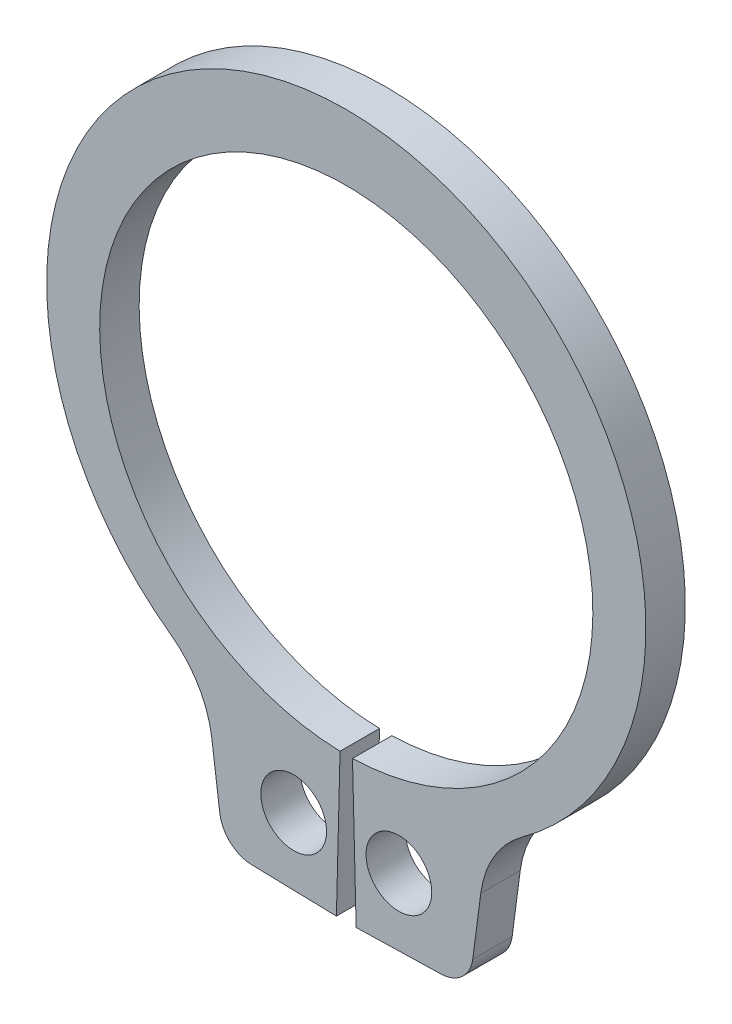
ISO-10303-21;
HEADER;
FILE_DESCRIPTION(('STEP AP214'),'2;1');
FILE_NAME('part.step','',(''),(''),'','','');
FILE_SCHEMA(('AUTOMOTIVE_DESIGN { 1 0 10303 214 1 1 1 1 }'));
ENDSEC;
DATA;
#1=APPLICATION_CONTEXT('core data for automotive mechanical design processes');
#2=APPLICATION_PROTOCOL_DEFINITION('international standard','automotive_design',2000,#1);
#3=PRODUCT_CONTEXT('',#1,'mechanical');
#4=PRODUCT('Part','Part','',(#3));
#5=PRODUCT_RELATED_PRODUCT_CATEGORY('part','',(#4));
#6=PRODUCT_DEFINITION_FORMATION('','',#4);
#7=PRODUCT_DEFINITION_CONTEXT('part definition',#1,'design');
#8=PRODUCT_DEFINITION('design','',#6,#7);
#9=PRODUCT_DEFINITION_SHAPE('','',#8);
#10=(LENGTH_UNIT() NAMED_UNIT(*) SI_UNIT(.MILLI.,.METRE.));
#11=(NAMED_UNIT(*) PLANE_ANGLE_UNIT() SI_UNIT($,.RADIAN.));
#12=(NAMED_UNIT(*) SI_UNIT($,.STERADIAN.) SOLID_ANGLE_UNIT());
#13=UNCERTAINTY_MEASURE_WITH_UNIT(LENGTH_MEASURE(1.E-05),#10,'distance_accuracy_value','');
#14=(GEOMETRIC_REPRESENTATION_CONTEXT(3) GLOBAL_UNCERTAINTY_ASSIGNED_CONTEXT((#13)) GLOBAL_UNIT_ASSIGNED_CONTEXT((#10,
#11,#12)) REPRESENTATION_CONTEXT('',''));
#15=CARTESIAN_POINT('',(0.,0.,0.));
#16=DIRECTION('',(0.,0.,1.));
#17=DIRECTION('',(1.,0.,0.));
#18=AXIS2_PLACEMENT_3D('',#15,#16,#17);
#19=CARTESIAN_POINT('',(0.,0.,-0.6));
#20=DIRECTION('',(0.,0.,1.));
#21=DIRECTION('',(1.,0.,0.));
#22=AXIS2_PLACEMENT_3D('',#19,#20,#21);
#23=CYLINDRICAL_SURFACE('',#22,3.75);
#24=CARTESIAN_POINT('',(0.,0.,0.));
#25=DIRECTION('',(0.,0.,-1.));
#26=DIRECTION('',(1.,0.,0.));
#27=AXIS2_PLACEMENT_3D('',#24,#25,#26);
#28=CIRCLE('',#27,3.75);
#29=CARTESIAN_POINT('',(-0.0945378151260504,-3.74880815746968,0.));
#30=VERTEX_POINT('',#29);
#31=CARTESIAN_POINT('',(0.0945378151260504,-3.74880815746968,0.));
#32=VERTEX_POINT('',#31);
#33=EDGE_CURVE('E156',#30,#32,#28,.T.);
#34=ORIENTED_EDGE('',*,*,#33,.F.);
#35=DIRECTION('',(0.,0.,1.));
#36=VECTOR('',#35,1.);
#37=CARTESIAN_POINT('',(-0.0945378151260504,-3.74880815746968,-0.6));
#38=LINE('',#37,#36);
#39=CARTESIAN_POINT('',(-0.0945378151260504,-3.74880815746968,-0.6));
#40=VERTEX_POINT('',#39);
#41=EDGE_CURVE('E11',#40,#30,#38,.T.);
#42=ORIENTED_EDGE('',*,*,#41,.F.);
#43=CARTESIAN_POINT('',(0.,0.,-0.6));
#44=DIRECTION('',(0.,0.,-1.));
#45=DIRECTION('',(1.,0.,0.));
#46=AXIS2_PLACEMENT_3D('',#43,#44,#45);
#47=CIRCLE('',#46,3.75);
#48=CARTESIAN_POINT('',(0.0945378151260504,-3.74880815746968,-0.6));
#49=VERTEX_POINT('',#48);
#50=EDGE_CURVE('E189',#40,#49,#47,.T.);
#51=ORIENTED_EDGE('',*,*,#50,.T.);
#52=DIRECTION('',(0.,0.,1.));
#53=VECTOR('',#52,1.);
#54=CARTESIAN_POINT('',(0.0945378151260504,-3.74880815746968,-0.6));
#55=LINE('',#54,#53);
#56=EDGE_CURVE('E38',#49,#32,#55,.T.);
#57=ORIENTED_EDGE('',*,*,#56,.T.);
#58=EDGE_LOOP('',(#34,#42,#51,#57));
#59=FACE_BOUND('',#58,.T.);
#60=ADVANCED_FACE('F35',(#59),#23,.F.);
#61=CARTESIAN_POINT('',(-0.0945378151260504,-3.74880815746968,-0.6));
#62=DIRECTION('',(0.999682175325247,-0.0252100840336134,0.));
#63=DIRECTION('',(0.0252100840336134,0.999682175325247,0.));
#64=AXIS2_PLACEMENT_3D('',#61,#62,#63);
#65=PLANE('',#64);
#66=DIRECTION('',(0.0252100840336134,0.999682175325247,0.));
#67=VECTOR('',#66,1.);
#68=CARTESIAN_POINT('',(-0.0945378151260504,-3.74880815746968,0.));
#69=LINE('',#68,#67);
#70=CARTESIAN_POINT('',(-0.15,-5.94810894318522,0.));
#71=VERTEX_POINT('',#70);
#72=EDGE_CURVE('E187',#71,#30,#69,.T.);
#73=ORIENTED_EDGE('',*,*,#72,.F.);
#74=DIRECTION('',(0.,0.,1.));
#75=VECTOR('',#74,1.);
#76=CARTESIAN_POINT('',(-0.15,-5.94810894318522,-0.6));
#77=LINE('',#76,#75);
#78=CARTESIAN_POINT('',(-0.15,-5.94810894318522,-0.6));
#79=VERTEX_POINT('',#78);
#80=EDGE_CURVE('E44',#79,#71,#77,.T.);
#81=ORIENTED_EDGE('',*,*,#80,.F.);
#82=DIRECTION('',(0.0252100840336134,0.999682175325247,0.));
#83=VECTOR('',#82,1.);
#84=CARTESIAN_POINT('',(-0.0945378151260504,-3.74880815746968,-0.6));
#85=LINE('',#84,#83);
#86=EDGE_CURVE('E146',#79,#40,#85,.T.);
#87=ORIENTED_EDGE('',*,*,#86,.T.);
#88=ORIENTED_EDGE('',*,*,#41,.T.);
#89=EDGE_LOOP('',(#73,#81,#87,#88));
#90=FACE_BOUND('',#89,.T.);
#91=ADVANCED_FACE('F209',(#90),#65,.T.);
#92=CARTESIAN_POINT('',(-0.15,-5.94810894318522,-0.6));
#93=DIRECTION('',(-0.025210084033613,-0.999682175325247,0.));
#94=DIRECTION('',(0.999682175325247,-0.025210084033613,0.));
#95=AXIS2_PLACEMENT_3D('',#92,#93,#94);
#96=PLANE('',#95);
#97=DIRECTION('',(0.999682175325247,-0.025210084033613,0.));
#98=VECTOR('',#97,1.);
#99=CARTESIAN_POINT('',(-0.15,-5.94810894318522,0.));
#100=LINE('',#99,#98);
#101=CARTESIAN_POINT('',(-1.43976416414528,-5.91558354284879,0.));
#102=VERTEX_POINT('',#101);
#103=EDGE_CURVE('E133',#102,#71,#100,.T.);
#104=ORIENTED_EDGE('',*,*,#103,.F.);
#105=DIRECTION('',(0.,0.,1.));
#106=VECTOR('',#105,1.);
#107=CARTESIAN_POINT('',(-1.43976416414528,-5.91558354284879,-0.6));
#108=LINE('',#107,#106);
#109=CARTESIAN_POINT('',(-1.43976416414528,-5.91558354284879,-0.6));
#110=VERTEX_POINT('',#109);
#111=EDGE_CURVE('E128',#110,#102,#108,.T.);
#112=ORIENTED_EDGE('',*,*,#111,.F.);
#113=DIRECTION('',(0.999682175325247,-0.025210084033613,0.));
#114=VECTOR('',#113,1.);
#115=CARTESIAN_POINT('',(-0.15,-5.94810894318522,-0.6));
#116=LINE('',#115,#114);
#117=EDGE_CURVE('E131',#110,#79,#116,.T.);
#118=ORIENTED_EDGE('',*,*,#117,.T.);
#119=ORIENTED_EDGE('',*,*,#80,.T.);
#120=EDGE_LOOP('',(#104,#112,#118,#119));
#121=FACE_BOUND('',#120,.T.);
#122=ADVANCED_FACE('F130',(#121),#96,.T.);
#123=CARTESIAN_POINT('',(-1.42715912212848,-5.41574245518617,-0.6));
#124=DIRECTION('',(0.,0.,1.));
#125=DIRECTION('',(1.,0.,0.));
#126=AXIS2_PLACEMENT_3D('',#123,#124,#125);
#127=CYLINDRICAL_SURFACE('',#126,0.5);
#128=CARTESIAN_POINT('',(-1.42715912212848,-5.41574245518617,0.));
#129=DIRECTION('',(0.,0.,1.));
#130=DIRECTION('',(1.,0.,0.));
#131=AXIS2_PLACEMENT_3D('',#128,#129,#130);
#132=CIRCLE('',#131,0.5);
#133=CARTESIAN_POINT('',(-1.92288155281538,-5.4810055512962,0.));
#134=VERTEX_POINT('',#133);
#135=EDGE_CURVE('E184',#134,#102,#132,.T.);
#136=ORIENTED_EDGE('',*,*,#135,.F.);
#137=DIRECTION('',(0.,0.,1.));
#138=VECTOR('',#137,1.);
#139=CARTESIAN_POINT('',(-1.92288155281538,-5.4810055512962,-0.6));
#140=LINE('',#139,#138);
#141=CARTESIAN_POINT('',(-1.92288155281538,-5.4810055512962,-0.6));
#142=VERTEX_POINT('',#141);
#143=EDGE_CURVE('E138',#142,#134,#140,.T.);
#144=ORIENTED_EDGE('',*,*,#143,.F.);
#145=CARTESIAN_POINT('',(-1.42715912212848,-5.41574245518617,-0.6));
#146=DIRECTION('',(0.,0.,1.));
#147=DIRECTION('',(1.,0.,0.));
#148=AXIS2_PLACEMENT_3D('',#145,#146,#147);
#149=CIRCLE('',#148,0.5);
#150=EDGE_CURVE('E144',#142,#110,#149,.T.);
#151=ORIENTED_EDGE('',*,*,#150,.T.);
#152=ORIENTED_EDGE('',*,*,#111,.T.);
#153=EDGE_LOOP('',(#136,#144,#151,#152));
#154=FACE_BOUND('',#153,.T.);
#155=ADVANCED_FACE('F148',(#154),#127,.T.);
#156=CARTESIAN_POINT('',(-2.04561881867482,-4.54872345935972,-0.6));
#157=DIRECTION('',(-0.99144486137381,-0.130526192220054,0.));
#158=DIRECTION('',(0.130526192220054,-0.99144486137381,0.));
#159=AXIS2_PLACEMENT_3D('',#156,#157,#158);
#160=PLANE('',#159);
#161=DIRECTION('',(0.130526192220054,-0.99144486137381,0.));
#162=VECTOR('',#161,1.);
#163=CARTESIAN_POINT('',(-2.04561881867482,-4.54872345935972,0.));
#164=LINE('',#163,#162);
#165=CARTESIAN_POINT('',(-2.04561881867482,-4.54872345935972,0.));
#166=VERTEX_POINT('',#165);
#167=EDGE_CURVE('E181',#166,#134,#164,.T.);
#168=ORIENTED_EDGE('',*,*,#167,.F.);
#169=DIRECTION('',(0.,0.,1.));
#170=VECTOR('',#169,1.);
#171=CARTESIAN_POINT('',(-2.04561881867482,-4.54872345935972,-0.6));
#172=LINE('',#171,#170);
#173=CARTESIAN_POINT('',(-2.04561881867482,-4.54872345935972,-0.6));
#174=VERTEX_POINT('',#173);
#175=EDGE_CURVE('E193',#174,#166,#172,.T.);
#176=ORIENTED_EDGE('',*,*,#175,.F.);
#177=DIRECTION('',(0.130526192220054,-0.99144486137381,0.));
#178=VECTOR('',#177,1.);
#179=CARTESIAN_POINT('',(-2.04561881867482,-4.54872345935972,-0.6));
#180=LINE('',#179,#178);
#181=EDGE_CURVE('E149',#174,#142,#180,.T.);
#182=ORIENTED_EDGE('',*,*,#181,.T.);
#183=ORIENTED_EDGE('',*,*,#143,.T.);
#184=EDGE_LOOP('',(#168,#176,#182,#183));
#185=FACE_BOUND('',#184,.T.);
#186=ADVANCED_FACE('F222',(#185),#160,.T.);
#187=CARTESIAN_POINT('',(-3.58198243178211,-4.75098956622769,-0.6));
#188=DIRECTION('',(0.,0.,1.));
#189=DIRECTION('',(1.,0.,0.));
#190=AXIS2_PLACEMENT_3D('',#187,#188,#189);
#191=CYLINDRICAL_SURFACE('',#190,1.54962083416157);
#192=CARTESIAN_POINT('',(-3.58198243178211,-4.75098956622769,0.));
#193=DIRECTION('',(0.,0.,-1.));
#194=DIRECTION('',(1.,0.,0.));
#195=AXIS2_PLACEMENT_3D('',#192,#193,#194);
#196=CIRCLE('',#195,1.54962083416157);
#197=CARTESIAN_POINT('',(-2.67290002702444,-3.49604179399666,0.));
#198=VERTEX_POINT('',#197);
#199=EDGE_CURVE('E178',#198,#166,#196,.T.);
#200=ORIENTED_EDGE('',*,*,#199,.F.);
#201=DIRECTION('',(0.,0.,1.));
#202=VECTOR('',#201,1.);
#203=CARTESIAN_POINT('',(-2.67290002702444,-3.49604179399666,-0.6));
#204=LINE('',#203,#202);
#205=CARTESIAN_POINT('',(-2.67290002702444,-3.49604179399666,-0.6));
#206=VERTEX_POINT('',#205);
#207=EDGE_CURVE('E195',#206,#198,#204,.T.);
#208=ORIENTED_EDGE('',*,*,#207,.F.);
#209=CARTESIAN_POINT('',(-3.58198243178211,-4.75098956622769,-0.6));
#210=DIRECTION('',(0.,0.,-1.));
#211=DIRECTION('',(1.,0.,0.));
#212=AXIS2_PLACEMENT_3D('',#209,#210,#211);
#213=CIRCLE('',#212,1.54962083416157);
#214=EDGE_CURVE('E151',#206,#174,#213,.T.);
#215=ORIENTED_EDGE('',*,*,#214,.T.);
#216=ORIENTED_EDGE('',*,*,#175,.T.);
#217=EDGE_LOOP('',(#200,#208,#215,#216));
#218=FACE_BOUND('',#217,.T.);
#219=ADVANCED_FACE('F225',(#218),#191,.F.);
#220=CARTESIAN_POINT('',(0.,0.193777651144577,-0.6));
#221=DIRECTION('',(0.,0.,1.));
#222=DIRECTION('',(1.,0.,0.));
#223=AXIS2_PLACEMENT_3D('',#220,#221,#222);
#224=CYLINDRICAL_SURFACE('',#223,4.55622234885542);
#225=CARTESIAN_POINT('',(0.,0.193777651144577,0.));
#226=DIRECTION('',(0.,0.,1.));
#227=DIRECTION('',(1.,0.,0.));
#228=AXIS2_PLACEMENT_3D('',#225,#226,#227);
#229=CIRCLE('',#228,4.55622234885542);
#230=CARTESIAN_POINT('',(2.67290002702444,-3.49604179399666,0.));
#231=VERTEX_POINT('',#230);
#232=EDGE_CURVE('E175',#231,#198,#229,.T.);
#233=ORIENTED_EDGE('',*,*,#232,.F.);
#234=DIRECTION('',(0.,0.,1.));
#235=VECTOR('',#234,1.);
#236=CARTESIAN_POINT('',(2.67290002702444,-3.49604179399666,-0.6));
#237=LINE('',#236,#235);
#238=CARTESIAN_POINT('',(2.67290002702444,-3.49604179399666,-0.6));
#239=VERTEX_POINT('',#238);
#240=EDGE_CURVE('E197',#239,#231,#237,.T.);
#241=ORIENTED_EDGE('',*,*,#240,.F.);
#242=CARTESIAN_POINT('',(0.,0.193777651144577,-0.6));
#243=DIRECTION('',(0.,0.,1.));
#244=DIRECTION('',(1.,0.,0.));
#245=AXIS2_PLACEMENT_3D('',#242,#243,#244);
#246=CIRCLE('',#245,4.55622234885542);
#247=EDGE_CURVE('E299',#239,#206,#246,.T.);
#248=ORIENTED_EDGE('',*,*,#247,.T.);
#249=ORIENTED_EDGE('',*,*,#207,.T.);
#250=EDGE_LOOP('',(#233,#241,#248,#249));
#251=FACE_BOUND('',#250,.T.);
#252=ADVANCED_FACE('F229',(#251),#224,.T.);
#253=CARTESIAN_POINT('',(3.58198243178211,-4.75098956622769,-0.6));
#254=DIRECTION('',(0.,0.,1.));
#255=DIRECTION('',(1.,0.,0.));
#256=AXIS2_PLACEMENT_3D('',#253,#254,#255);
#257=CYLINDRICAL_SURFACE('',#256,1.54962083416157);
#258=CARTESIAN_POINT('',(3.58198243178211,-4.75098956622769,0.));
#259=DIRECTION('',(0.,0.,-1.));
#260=DIRECTION('',(1.,0.,0.));
#261=AXIS2_PLACEMENT_3D('',#258,#259,#260);
#262=CIRCLE('',#261,1.54962083416157);
#263=CARTESIAN_POINT('',(2.04561881867482,-4.54872345935972,0.));
#264=VERTEX_POINT('',#263);
#265=EDGE_CURVE('E172',#264,#231,#262,.T.);
#266=ORIENTED_EDGE('',*,*,#265,.F.);
#267=DIRECTION('',(0.,0.,1.));
#268=VECTOR('',#267,1.);
#269=CARTESIAN_POINT('',(2.04561881867482,-4.54872345935972,-0.6));
#270=LINE('',#269,#268);
#271=CARTESIAN_POINT('',(2.04561881867482,-4.54872345935972,-0.6));
#272=VERTEX_POINT('',#271);
#273=EDGE_CURVE('E199',#272,#264,#270,.T.);
#274=ORIENTED_EDGE('',*,*,#273,.F.);
#275=CARTESIAN_POINT('',(3.58198243178211,-4.75098956622769,-0.6));
#276=DIRECTION('',(0.,0.,-1.));
#277=DIRECTION('',(1.,0.,0.));
#278=AXIS2_PLACEMENT_3D('',#275,#276,#277);
#279=CIRCLE('',#278,1.54962083416157);
#280=EDGE_CURVE('E296',#272,#239,#279,.T.);
#281=ORIENTED_EDGE('',*,*,#280,.T.);
#282=ORIENTED_EDGE('',*,*,#240,.T.);
#283=EDGE_LOOP('',(#266,#274,#281,#282));
#284=FACE_BOUND('',#283,.T.);
#285=ADVANCED_FACE('F233',(#284),#257,.F.);
#286=CARTESIAN_POINT('',(2.04561881867482,-4.54872345935972,-0.6));
#287=DIRECTION('',(0.99144486137381,-0.130526192220054,0.));
#288=DIRECTION('',(0.130526192220054,0.99144486137381,0.));
#289=AXIS2_PLACEMENT_3D('',#286,#287,#288);
#290=PLANE('',#289);
#291=DIRECTION('',(0.130526192220054,0.99144486137381,0.));
#292=VECTOR('',#291,1.);
#293=CARTESIAN_POINT('',(2.04561881867482,-4.54872345935972,0.));
#294=LINE('',#293,#292);
#295=CARTESIAN_POINT('',(1.92288155281538,-5.4810055512962,0.));
#296=VERTEX_POINT('',#295);
#297=EDGE_CURVE('E169',#296,#264,#294,.T.);
#298=ORIENTED_EDGE('',*,*,#297,.F.);
#299=DIRECTION('',(0.,0.,1.));
#300=VECTOR('',#299,1.);
#301=CARTESIAN_POINT('',(1.92288155281538,-5.4810055512962,-0.6));
#302=LINE('',#301,#300);
#303=CARTESIAN_POINT('',(1.92288155281538,-5.4810055512962,-0.6));
#304=VERTEX_POINT('',#303);
#305=EDGE_CURVE('E201',#304,#296,#302,.T.);
#306=ORIENTED_EDGE('',*,*,#305,.F.);
#307=DIRECTION('',(0.130526192220054,0.99144486137381,0.));
#308=VECTOR('',#307,1.);
#309=CARTESIAN_POINT('',(2.04561881867482,-4.54872345935972,-0.6));
#310=LINE('',#309,#308);
#311=EDGE_CURVE('E293',#304,#272,#310,.T.);
#312=ORIENTED_EDGE('',*,*,#311,.T.);
#313=ORIENTED_EDGE('',*,*,#273,.T.);
#314=EDGE_LOOP('',(#298,#306,#312,#313));
#315=FACE_BOUND('',#314,.T.);
#316=ADVANCED_FACE('F237',(#315),#290,.T.);
#317=CARTESIAN_POINT('',(1.42715912212848,-5.41574245518617,-0.6));
#318=DIRECTION('',(0.,0.,1.));
#319=DIRECTION('',(1.,0.,0.));
#320=AXIS2_PLACEMENT_3D('',#317,#318,#319);
#321=CYLINDRICAL_SURFACE('',#320,0.5);
#322=CARTESIAN_POINT('',(1.42715912212848,-5.41574245518617,0.));
#323=DIRECTION('',(0.,0.,1.));
#324=DIRECTION('',(-1.,0.,0.));
#325=AXIS2_PLACEMENT_3D('',#322,#323,#324);
#326=CIRCLE('',#325,0.5);
#327=CARTESIAN_POINT('',(1.43976416414528,-5.91558354284879,0.));
#328=VERTEX_POINT('',#327);
#329=EDGE_CURVE('E166',#328,#296,#326,.T.);
#330=ORIENTED_EDGE('',*,*,#329,.F.);
#331=DIRECTION('',(0.,0.,1.));
#332=VECTOR('',#331,1.);
#333=CARTESIAN_POINT('',(1.43976416414528,-5.91558354284879,-0.6));
#334=LINE('',#333,#332);
#335=CARTESIAN_POINT('',(1.43976416414528,-5.91558354284879,-0.6));
#336=VERTEX_POINT('',#335);
#337=EDGE_CURVE('E203',#336,#328,#334,.T.);
#338=ORIENTED_EDGE('',*,*,#337,.F.);
#339=CARTESIAN_POINT('',(1.42715912212848,-5.41574245518617,-0.6));
#340=DIRECTION('',(0.,0.,1.));
#341=DIRECTION('',(-1.,0.,0.));
#342=AXIS2_PLACEMENT_3D('',#339,#340,#341);
#343=CIRCLE('',#342,0.5);
#344=EDGE_CURVE('E290',#336,#304,#343,.T.);
#345=ORIENTED_EDGE('',*,*,#344,.T.);
#346=ORIENTED_EDGE('',*,*,#305,.T.);
#347=EDGE_LOOP('',(#330,#338,#345,#346));
#348=FACE_BOUND('',#347,.T.);
#349=ADVANCED_FACE('F241',(#348),#321,.T.);
#350=CARTESIAN_POINT('',(0.15,-5.94810894318522,-0.6));
#351=DIRECTION('',(0.025210084033613,-0.999682175325247,0.));
#352=DIRECTION('',(0.999682175325247,0.025210084033613,0.));
#353=AXIS2_PLACEMENT_3D('',#350,#351,#352);
#354=PLANE('',#353);
#355=DIRECTION('',(0.999682175325247,0.025210084033613,0.));
#356=VECTOR('',#355,1.);
#357=CARTESIAN_POINT('',(0.15,-5.94810894318522,0.));
#358=LINE('',#357,#356);
#359=CARTESIAN_POINT('',(0.15,-5.94810894318522,0.));
#360=VERTEX_POINT('',#359);
#361=EDGE_CURVE('E163',#360,#328,#358,.T.);
#362=ORIENTED_EDGE('',*,*,#361,.F.);
#363=DIRECTION('',(0.,0.,1.));
#364=VECTOR('',#363,1.);
#365=CARTESIAN_POINT('',(0.15,-5.94810894318522,-0.6));
#366=LINE('',#365,#364);
#367=CARTESIAN_POINT('',(0.15,-5.94810894318522,-0.6));
#368=VERTEX_POINT('',#367);
#369=EDGE_CURVE('E204',#368,#360,#366,.T.);
#370=ORIENTED_EDGE('',*,*,#369,.F.);
#371=DIRECTION('',(0.999682175325247,0.025210084033613,0.));
#372=VECTOR('',#371,1.);
#373=CARTESIAN_POINT('',(0.15,-5.94810894318522,-0.6));
#374=LINE('',#373,#372);
#375=EDGE_CURVE('E287',#368,#336,#374,.T.);
#376=ORIENTED_EDGE('',*,*,#375,.T.);
#377=ORIENTED_EDGE('',*,*,#337,.T.);
#378=EDGE_LOOP('',(#362,#370,#376,#377));
#379=FACE_BOUND('',#378,.T.);
#380=ADVANCED_FACE('F245',(#379),#354,.T.);
#381=CARTESIAN_POINT('',(0.0945378151260504,-3.74880815746968,-0.6));
#382=DIRECTION('',(-0.999682175325247,-0.0252100840336134,0.));
#383=DIRECTION('',(0.0252100840336134,-0.999682175325247,0.));
#384=AXIS2_PLACEMENT_3D('',#381,#382,#383);
#385=PLANE('',#384);
#386=DIRECTION('',(0.0252100840336134,-0.999682175325247,0.));
#387=VECTOR('',#386,1.);
#388=CARTESIAN_POINT('',(0.0945378151260504,-3.74880815746968,0.));
#389=LINE('',#388,#387);
#390=EDGE_CURVE('E159',#32,#360,#389,.T.);
#391=ORIENTED_EDGE('',*,*,#390,.F.);
#392=ORIENTED_EDGE('',*,*,#56,.F.);
#393=DIRECTION('',(0.0252100840336134,-0.999682175325247,0.));
#394=VECTOR('',#393,1.);
#395=CARTESIAN_POINT('',(0.0945378151260504,-3.74880815746968,-0.6));
#396=LINE('',#395,#394);
#397=EDGE_CURVE('E285',#49,#368,#396,.T.);
#398=ORIENTED_EDGE('',*,*,#397,.T.);
#399=ORIENTED_EDGE('',*,*,#369,.T.);
#400=EDGE_LOOP('',(#391,#392,#398,#399));
#401=FACE_BOUND('',#400,.T.);
#402=ADVANCED_FACE('F206',(#401),#385,.T.);
#403=CARTESIAN_POINT('',(0.,0.,-0.6));
#404=DIRECTION('',(0.,0.,1.));
#405=DIRECTION('',(1.,0.,0.));
#406=AXIS2_PLACEMENT_3D('',#403,#404,#405);
#407=PLANE('',#406);
#408=CARTESIAN_POINT('',(-0.8,-4.91025712157724,-0.6));
#409=DIRECTION('',(0.,0.,1.));
#410=DIRECTION('',(1.,0.,0.));
#411=AXIS2_PLACEMENT_3D('',#408,#409,#410);
#412=CIRCLE('',#411,0.5);
#413=CARTESIAN_POINT('',(-0.3,-4.91025712157724,-0.6));
#414=VERTEX_POINT('',#413);
#415=EDGE_CURVE('E272',#414,#414,#412,.T.);
#416=ORIENTED_EDGE('',*,*,#415,.T.);
#417=EDGE_LOOP('',(#416));
#418=FACE_BOUND('',#417,.T.);
#419=CARTESIAN_POINT('',(0.8,-4.91025712157724,-0.6));
#420=DIRECTION('',(0.,0.,1.));
#421=DIRECTION('',(1.,0.,0.));
#422=AXIS2_PLACEMENT_3D('',#419,#420,#421);
#423=CIRCLE('',#422,0.5);
#424=CARTESIAN_POINT('',(1.3,-4.91025712157724,-0.6));
#425=VERTEX_POINT('',#424);
#426=EDGE_CURVE('E160',#425,#425,#423,.T.);
#427=ORIENTED_EDGE('',*,*,#426,.T.);
#428=EDGE_LOOP('',(#427));
#429=FACE_BOUND('',#428,.T.);
#430=ORIENTED_EDGE('',*,*,#50,.F.);
#431=ORIENTED_EDGE('',*,*,#86,.F.);
#432=ORIENTED_EDGE('',*,*,#117,.F.);
#433=ORIENTED_EDGE('',*,*,#150,.F.);
#434=ORIENTED_EDGE('',*,*,#181,.F.);
#435=ORIENTED_EDGE('',*,*,#214,.F.);
#436=ORIENTED_EDGE('',*,*,#247,.F.);
#437=ORIENTED_EDGE('',*,*,#280,.F.);
#438=ORIENTED_EDGE('',*,*,#311,.F.);
#439=ORIENTED_EDGE('',*,*,#344,.F.);
#440=ORIENTED_EDGE('',*,*,#375,.F.);
#441=ORIENTED_EDGE('',*,*,#397,.F.);
#442=EDGE_LOOP('',(#430,#431,#432,#433,#434,#435,#436,#437,#438,#439,#440,#441));
#443=FACE_BOUND('',#442,.T.);
#444=ADVANCED_FACE('F142',(#418,#429,#443),#407,.F.);
#445=CARTESIAN_POINT('',(0.,0.,0.));
#446=DIRECTION('',(0.,0.,1.));
#447=DIRECTION('',(1.,0.,0.));
#448=AXIS2_PLACEMENT_3D('',#445,#446,#447);
#449=PLANE('',#448);
#450=CARTESIAN_POINT('',(-0.8,-4.91025712157724,0.));
#451=DIRECTION('',(0.,0.,1.));
#452=DIRECTION('',(1.,0.,0.));
#453=AXIS2_PLACEMENT_3D('',#450,#451,#452);
#454=CIRCLE('',#453,0.5);
#455=CARTESIAN_POINT('',(-0.3,-4.91025712157724,0.));
#456=VERTEX_POINT('',#455);
#457=EDGE_CURVE('E275',#456,#456,#454,.T.);
#458=ORIENTED_EDGE('',*,*,#457,.F.);
#459=EDGE_LOOP('',(#458));
#460=FACE_BOUND('',#459,.T.);
#461=CARTESIAN_POINT('',(0.8,-4.91025712157724,0.));
#462=DIRECTION('',(0.,0.,1.));
#463=DIRECTION('',(1.,0.,0.));
#464=AXIS2_PLACEMENT_3D('',#461,#462,#463);
#465=CIRCLE('',#464,0.5);
#466=CARTESIAN_POINT('',(1.3,-4.91025712157724,0.));
#467=VERTEX_POINT('',#466);
#468=EDGE_CURVE('E277',#467,#467,#465,.T.);
#469=ORIENTED_EDGE('',*,*,#468,.F.);
#470=EDGE_LOOP('',(#469));
#471=FACE_BOUND('',#470,.T.);
#472=ORIENTED_EDGE('',*,*,#33,.T.);
#473=ORIENTED_EDGE('',*,*,#390,.T.);
#474=ORIENTED_EDGE('',*,*,#361,.T.);
#475=ORIENTED_EDGE('',*,*,#329,.T.);
#476=ORIENTED_EDGE('',*,*,#297,.T.);
#477=ORIENTED_EDGE('',*,*,#265,.T.);
#478=ORIENTED_EDGE('',*,*,#232,.T.);
#479=ORIENTED_EDGE('',*,*,#199,.T.);
#480=ORIENTED_EDGE('',*,*,#167,.T.);
#481=ORIENTED_EDGE('',*,*,#135,.T.);
#482=ORIENTED_EDGE('',*,*,#103,.T.);
#483=ORIENTED_EDGE('',*,*,#72,.T.);
#484=EDGE_LOOP('',(#472,#473,#474,#475,#476,#477,#478,#479,#480,#481,#482,#483));
#485=FACE_BOUND('',#484,.T.);
#486=ADVANCED_FACE('F208',(#460,#471,#485),#449,.T.);
#487=CARTESIAN_POINT('',(0.8,-4.91025712157724,-0.6));
#488=DIRECTION('',(0.,0.,1.));
#489=DIRECTION('',(1.,0.,0.));
#490=AXIS2_PLACEMENT_3D('',#487,#488,#489);
#491=CYLINDRICAL_SURFACE('',#490,0.5);
#492=ORIENTED_EDGE('',*,*,#426,.F.);
#493=EDGE_LOOP('',(#492));
#494=FACE_BOUND('',#493,.T.);
#495=ORIENTED_EDGE('',*,*,#468,.T.);
#496=EDGE_LOOP('',(#495));
#497=FACE_BOUND('',#496,.T.);
#498=ADVANCED_FACE('F257',(#494,#497),#491,.F.);
#499=CARTESIAN_POINT('',(-0.8,-4.91025712157724,-0.6));
#500=DIRECTION('',(0.,0.,1.));
#501=DIRECTION('',(1.,0.,0.));
#502=AXIS2_PLACEMENT_3D('',#499,#500,#501);
#503=CYLINDRICAL_SURFACE('',#502,0.5);
#504=ORIENTED_EDGE('',*,*,#415,.F.);
#505=EDGE_LOOP('',(#504));
#506=FACE_BOUND('',#505,.T.);
#507=ORIENTED_EDGE('',*,*,#457,.T.);
#508=EDGE_LOOP('',(#507));
#509=FACE_BOUND('',#508,.T.);
#510=ADVANCED_FACE('F264',(#506,#509),#503,.F.);
#511=CLOSED_SHELL('',(#60,#91,#122,#155,#186,#219,#252,#285,#316,#349,#380,#402,#444,#486,#498,#510));
#512=MANIFOLD_SOLID_BREP('B2',#511);
#513=ADVANCED_BREP_SHAPE_REPRESENTATION('',(#18,#512),#14);
#514=SHAPE_DEFINITION_REPRESENTATION(#9,#513);
ENDSEC;
END-ISO-10303-21;
